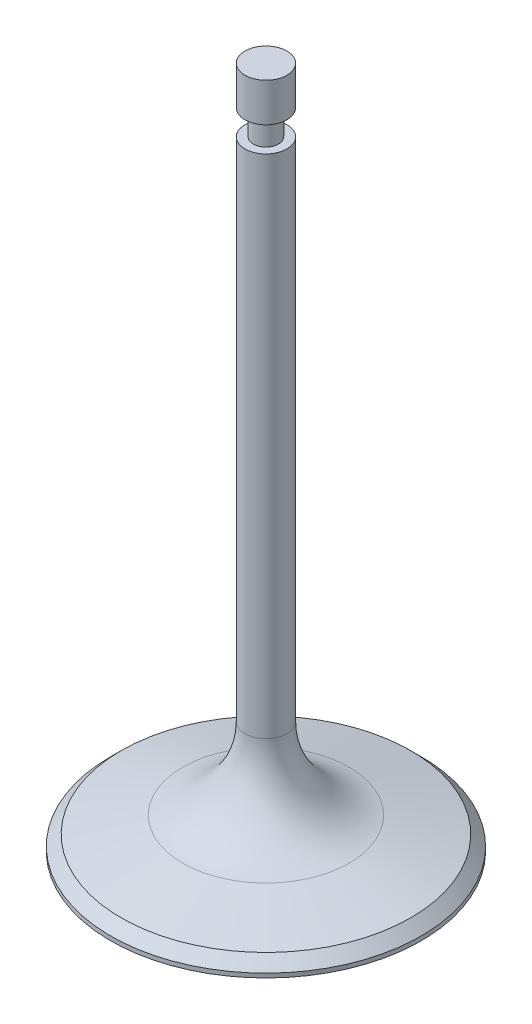
ISO-10303-21;
HEADER;
FILE_DESCRIPTION(('STEP AP214'),'2;1');
FILE_NAME('part.step','',(''),(''),'','','');
FILE_SCHEMA(('AUTOMOTIVE_DESIGN { 1 0 10303 214 1 1 1 1 }'));
ENDSEC;
DATA;
#1=APPLICATION_CONTEXT('core data for automotive mechanical design processes');
#2=APPLICATION_PROTOCOL_DEFINITION('international standard','automotive_design',2000,#1);
#3=PRODUCT_CONTEXT('',#1,'mechanical');
#4=PRODUCT('Part','Part','',(#3));
#5=PRODUCT_RELATED_PRODUCT_CATEGORY('part','',(#4));
#6=PRODUCT_DEFINITION_FORMATION('','',#4);
#7=PRODUCT_DEFINITION_CONTEXT('part definition',#1,'design');
#8=PRODUCT_DEFINITION('design','',#6,#7);
#9=PRODUCT_DEFINITION_SHAPE('','',#8);
#10=(LENGTH_UNIT() NAMED_UNIT(*) SI_UNIT(.MILLI.,.METRE.));
#11=(NAMED_UNIT(*) PLANE_ANGLE_UNIT() SI_UNIT($,.RADIAN.));
#12=(NAMED_UNIT(*) SI_UNIT($,.STERADIAN.) SOLID_ANGLE_UNIT());
#13=UNCERTAINTY_MEASURE_WITH_UNIT(LENGTH_MEASURE(1.E-05),#10,'distance_accuracy_value','');
#14=(GEOMETRIC_REPRESENTATION_CONTEXT(3) GLOBAL_UNCERTAINTY_ASSIGNED_CONTEXT((#13)) GLOBAL_UNIT_ASSIGNED_CONTEXT((#10,
#11,#12)) REPRESENTATION_CONTEXT('',''));
#15=CARTESIAN_POINT('',(0.,0.,0.));
#16=DIRECTION('',(0.,0.,1.));
#17=DIRECTION('',(1.,0.,0.));
#18=AXIS2_PLACEMENT_3D('',#15,#16,#17);
#19=CARTESIAN_POINT('',(0.,0.,0.));
#20=DIRECTION('',(0.,-1.,0.));
#21=DIRECTION('',(1.,0.,0.));
#22=AXIS2_PLACEMENT_3D('',#19,#20,#21);
#23=CONICAL_SURFACE('',#22,18.5,0.785398163397452);
#24=CARTESIAN_POINT('',(0.,1.25,0.));
#25=DIRECTION('',(0.,1.,0.));
#26=DIRECTION('',(-1.,0.,0.));
#27=AXIS2_PLACEMENT_3D('',#24,#25,#26);
#28=CIRCLE('',#27,17.25);
#29=CARTESIAN_POINT('',(-17.25,1.25,0.));
#30=VERTEX_POINT('',#29);
#31=EDGE_CURVE('E72',#30,#30,#28,.T.);
#32=ORIENTED_EDGE('',*,*,#31,.F.);
#33=EDGE_LOOP('',(#32));
#34=FACE_BOUND('',#33,.T.);
#35=CARTESIAN_POINT('',(0.,0.,0.));
#36=DIRECTION('',(0.,1.,0.));
#37=DIRECTION('',(-1.,0.,0.));
#38=AXIS2_PLACEMENT_3D('',#35,#36,#37);
#39=CIRCLE('',#38,18.5);
#40=CARTESIAN_POINT('',(-18.5,0.,0.));
#41=VERTEX_POINT('',#40);
#42=EDGE_CURVE('E10',#41,#41,#39,.T.);
#43=ORIENTED_EDGE('',*,*,#42,.T.);
#44=EDGE_LOOP('',(#43));
#45=FACE_BOUND('',#44,.T.);
#46=ADVANCED_FACE('F38',(#34,#45),#23,.T.);
#47=CARTESIAN_POINT('',(0.,80.79,0.));
#48=DIRECTION('',(0.,1.,0.));
#49=DIRECTION('',(-1.,0.,0.));
#50=AXIS2_PLACEMENT_3D('',#47,#48,#49);
#51=CYLINDRICAL_SURFACE('',#50,18.5);
#52=ORIENTED_EDGE('',*,*,#42,.F.);
#53=EDGE_LOOP('',(#52));
#54=FACE_BOUND('',#53,.T.);
#55=CARTESIAN_POINT('',(0.,-0.5,0.));
#56=DIRECTION('',(0.,1.,0.));
#57=DIRECTION('',(-1.,0.,0.));
#58=AXIS2_PLACEMENT_3D('',#55,#56,#57);
#59=CIRCLE('',#58,18.5);
#60=CARTESIAN_POINT('',(-18.5,-0.500000000000003,0.));
#61=VERTEX_POINT('',#60);
#62=EDGE_CURVE('E44',#61,#61,#59,.T.);
#63=ORIENTED_EDGE('',*,*,#62,.T.);
#64=EDGE_LOOP('',(#63));
#65=FACE_BOUND('',#64,.T.);
#66=ADVANCED_FACE('F79',(#54,#65),#51,.T.);
#67=CARTESIAN_POINT('',(0.,112.833333333333,0.));
#68=DIRECTION('',(0.,1.,0.));
#69=DIRECTION('',(-1.,0.,0.));
#70=AXIS2_PLACEMENT_3D('',#67,#68,#69);
#71=SPHERICAL_SURFACE('',#70,114.833333333333);
#72=ORIENTED_EDGE('',*,*,#62,.F.);
#73=EDGE_LOOP('',(#72));
#74=FACE_BOUND('',#73,.T.);
#75=ADVANCED_FACE('F83',(#74),#71,.T.);
#76=CARTESIAN_POINT('',(2.49999999999998,80.79,0.));
#77=DIRECTION('',(0.,-1.,0.));
#78=DIRECTION('',(1.,0.,0.));
#79=AXIS2_PLACEMENT_3D('',#76,#77,#78);
#80=PLANE('',#79);
#81=CARTESIAN_POINT('',(0.,80.79,0.));
#82=DIRECTION('',(0.,1.,0.));
#83=DIRECTION('',(-1.,0.,0.));
#84=AXIS2_PLACEMENT_3D('',#81,#82,#83);
#85=CIRCLE('',#84,2.49999999999998);
#86=CARTESIAN_POINT('',(-2.49999999999998,80.79,0.));
#87=VERTEX_POINT('',#86);
#88=EDGE_CURVE('E48',#87,#87,#85,.T.);
#89=ORIENTED_EDGE('',*,*,#88,.T.);
#90=EDGE_LOOP('',(#89));
#91=FACE_BOUND('',#90,.T.);
#92=ADVANCED_FACE('F88',(#91),#80,.F.);
#93=CARTESIAN_POINT('',(0.,80.79,0.));
#94=DIRECTION('',(0.,1.,0.));
#95=DIRECTION('',(-1.,0.,0.));
#96=AXIS2_PLACEMENT_3D('',#93,#94,#95);
#97=CYLINDRICAL_SURFACE('',#96,2.49999999999998);
#98=ORIENTED_EDGE('',*,*,#88,.F.);
#99=EDGE_LOOP('',(#98));
#100=FACE_BOUND('',#99,.T.);
#101=CARTESIAN_POINT('',(0.,76.19,0.));
#102=DIRECTION('',(0.,1.,0.));
#103=DIRECTION('',(-1.,0.,0.));
#104=AXIS2_PLACEMENT_3D('',#101,#102,#103);
#105=CIRCLE('',#104,2.49999999999998);
#106=CARTESIAN_POINT('',(-2.49999999999998,76.19,0.));
#107=VERTEX_POINT('',#106);
#108=EDGE_CURVE('E52',#107,#107,#105,.T.);
#109=ORIENTED_EDGE('',*,*,#108,.T.);
#110=EDGE_LOOP('',(#109));
#111=FACE_BOUND('',#110,.T.);
#112=ADVANCED_FACE('F94',(#100,#111),#97,.T.);
#113=CARTESIAN_POINT('',(1.49999999999998,76.19,0.));
#114=DIRECTION('',(0.,1.,0.));
#115=DIRECTION('',(-1.,0.,0.));
#116=AXIS2_PLACEMENT_3D('',#113,#114,#115);
#117=PLANE('',#116);
#118=ORIENTED_EDGE('',*,*,#108,.F.);
#119=EDGE_LOOP('',(#118));
#120=FACE_BOUND('',#119,.T.);
#121=CARTESIAN_POINT('',(0.,76.19,0.));
#122=DIRECTION('',(0.,1.,0.));
#123=DIRECTION('',(-1.,0.,0.));
#124=AXIS2_PLACEMENT_3D('',#121,#122,#123);
#125=CIRCLE('',#124,1.49999999999998);
#126=CARTESIAN_POINT('',(-1.49999999999998,76.19,0.));
#127=VERTEX_POINT('',#126);
#128=EDGE_CURVE('E57',#127,#127,#125,.T.);
#129=ORIENTED_EDGE('',*,*,#128,.T.);
#130=EDGE_LOOP('',(#129));
#131=FACE_BOUND('',#130,.T.);
#132=ADVANCED_FACE('F98',(#120,#131),#117,.F.);
#133=CARTESIAN_POINT('',(0.,80.79,0.));
#134=DIRECTION('',(0.,1.,0.));
#135=DIRECTION('',(-1.,0.,0.));
#136=AXIS2_PLACEMENT_3D('',#133,#134,#135);
#137=CYLINDRICAL_SURFACE('',#136,1.49999999999998);
#138=ORIENTED_EDGE('',*,*,#128,.F.);
#139=EDGE_LOOP('',(#138));
#140=FACE_BOUND('',#139,.T.);
#141=CARTESIAN_POINT('',(0.,73.19,0.));
#142=DIRECTION('',(0.,1.,0.));
#143=DIRECTION('',(-1.,0.,0.));
#144=AXIS2_PLACEMENT_3D('',#141,#142,#143);
#145=CIRCLE('',#144,1.49999999999998);
#146=CARTESIAN_POINT('',(-1.49999999999998,73.19,0.));
#147=VERTEX_POINT('',#146);
#148=EDGE_CURVE('E60',#147,#147,#145,.T.);
#149=ORIENTED_EDGE('',*,*,#148,.T.);
#150=EDGE_LOOP('',(#149));
#151=FACE_BOUND('',#150,.T.);
#152=ADVANCED_FACE('F102',(#140,#151),#137,.T.);
#153=CARTESIAN_POINT('',(2.49999999999998,73.19,0.));
#154=DIRECTION('',(0.,-1.,0.));
#155=DIRECTION('',(1.,0.,0.));
#156=AXIS2_PLACEMENT_3D('',#153,#154,#155);
#157=PLANE('',#156);
#158=ORIENTED_EDGE('',*,*,#148,.F.);
#159=EDGE_LOOP('',(#158));
#160=FACE_BOUND('',#159,.T.);
#161=CARTESIAN_POINT('',(0.,73.19,0.));
#162=DIRECTION('',(0.,1.,0.));
#163=DIRECTION('',(-1.,0.,0.));
#164=AXIS2_PLACEMENT_3D('',#161,#162,#163);
#165=CIRCLE('',#164,2.49999999999998);
#166=CARTESIAN_POINT('',(-2.49999999999998,73.19,0.));
#167=VERTEX_POINT('',#166);
#168=EDGE_CURVE('E63',#167,#167,#165,.T.);
#169=ORIENTED_EDGE('',*,*,#168,.T.);
#170=EDGE_LOOP('',(#169));
#171=FACE_BOUND('',#170,.T.);
#172=ADVANCED_FACE('F106',(#160,#171),#157,.F.);
#173=CARTESIAN_POINT('',(0.,80.79,0.));
#174=DIRECTION('',(0.,1.,0.));
#175=DIRECTION('',(-1.,0.,0.));
#176=AXIS2_PLACEMENT_3D('',#173,#174,#175);
#177=CYLINDRICAL_SURFACE('',#176,2.49999999999998);
#178=ORIENTED_EDGE('',*,*,#168,.F.);
#179=EDGE_LOOP('',(#178));
#180=FACE_BOUND('',#179,.T.);
#181=CARTESIAN_POINT('',(0.,12.8755204681486,0.));
#182=DIRECTION('',(0.,1.,0.));
#183=DIRECTION('',(-1.,0.,0.));
#184=AXIS2_PLACEMENT_3D('',#181,#182,#183);
#185=CIRCLE('',#184,2.49999999999997);
#186=CARTESIAN_POINT('',(-2.49999999999996,12.8755204681486,0.));
#187=VERTEX_POINT('',#186);
#188=EDGE_CURVE('E66',#187,#187,#185,.T.);
#189=ORIENTED_EDGE('',*,*,#188,.T.);
#190=EDGE_LOOP('',(#189));
#191=FACE_BOUND('',#190,.T.);
#192=ADVANCED_FACE('F110',(#180,#191),#177,.T.);
#193=CARTESIAN_POINT('',(0.,12.8755204681486,0.));
#194=DIRECTION('',(0.,1.,0.));
#195=DIRECTION('',(-1.,0.,0.));
#196=AXIS2_PLACEMENT_3D('',#193,#194,#195);
#197=TOROIDAL_SURFACE('',#196,12.5,10.);
#198=ORIENTED_EDGE('',*,*,#188,.F.);
#199=EDGE_LOOP('',(#198));
#200=FACE_BOUND('',#199,.T.);
#201=CARTESIAN_POINT('',(0.,3.21626220525792,0.));
#202=DIRECTION('',(0.,1.,0.));
#203=DIRECTION('',(-1.,0.,0.));
#204=AXIS2_PLACEMENT_3D('',#201,#202,#203);
#205=CIRCLE('',#204,9.91180954897483);
#206=CARTESIAN_POINT('',(-9.91180954897482,3.21626220525792,0.));
#207=VERTEX_POINT('',#206);
#208=EDGE_CURVE('E69',#207,#207,#205,.T.);
#209=ORIENTED_EDGE('',*,*,#208,.T.);
#210=EDGE_LOOP('',(#209));
#211=FACE_BOUND('',#210,.T.);
#212=ADVANCED_FACE('F114',(#200,#211),#197,.F.);
#213=CARTESIAN_POINT('',(0.,1.25,0.));
#214=DIRECTION('',(0.,-1.,0.));
#215=DIRECTION('',(1.,0.,0.));
#216=AXIS2_PLACEMENT_3D('',#213,#214,#215);
#217=CONICAL_SURFACE('',#216,17.25,1.30899693899575);
#218=ORIENTED_EDGE('',*,*,#208,.F.);
#219=EDGE_LOOP('',(#218));
#220=FACE_BOUND('',#219,.T.);
#221=ORIENTED_EDGE('',*,*,#31,.T.);
#222=EDGE_LOOP('',(#221));
#223=FACE_BOUND('',#222,.T.);
#224=ADVANCED_FACE('F76',(#220,#223),#217,.T.);
#225=CLOSED_SHELL('',(#46,#66,#75,#92,#112,#132,#152,#172,#192,#212,#224));
#226=MANIFOLD_SOLID_BREP('B2',#225);
#227=ADVANCED_BREP_SHAPE_REPRESENTATION('',(#18,#226),#14);
#228=SHAPE_DEFINITION_REPRESENTATION(#9,#227);
ENDSEC;
END-ISO-10303-21;
